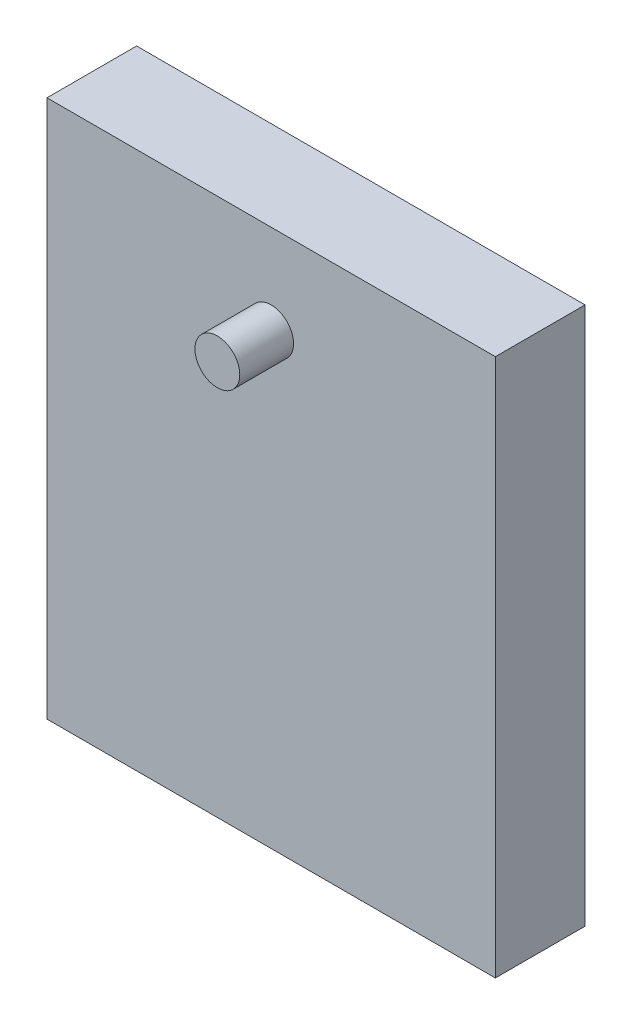
ISO-10303-21;
HEADER;
FILE_DESCRIPTION(('STEP AP214'),'2;1');
FILE_NAME('part.step','',(''),(''),'','','');
FILE_SCHEMA(('AUTOMOTIVE_DESIGN { 1 0 10303 214 1 1 1 1 }'));
ENDSEC;
DATA;
#1=APPLICATION_CONTEXT('core data for automotive mechanical design processes');
#2=APPLICATION_PROTOCOL_DEFINITION('international standard','automotive_design',2000,#1);
#3=PRODUCT_CONTEXT('',#1,'mechanical');
#4=PRODUCT('Part','Part','',(#3));
#5=PRODUCT_RELATED_PRODUCT_CATEGORY('part','',(#4));
#6=PRODUCT_DEFINITION_FORMATION('','',#4);
#7=PRODUCT_DEFINITION_CONTEXT('part definition',#1,'design');
#8=PRODUCT_DEFINITION('design','',#6,#7);
#9=PRODUCT_DEFINITION_SHAPE('','',#8);
#10=(LENGTH_UNIT() NAMED_UNIT(*) SI_UNIT(.MILLI.,.METRE.));
#11=(NAMED_UNIT(*) PLANE_ANGLE_UNIT() SI_UNIT($,.RADIAN.));
#12=(NAMED_UNIT(*) SI_UNIT($,.STERADIAN.) SOLID_ANGLE_UNIT());
#13=UNCERTAINTY_MEASURE_WITH_UNIT(LENGTH_MEASURE(1.E-05),#10,'distance_accuracy_value','');
#14=(GEOMETRIC_REPRESENTATION_CONTEXT(3) GLOBAL_UNCERTAINTY_ASSIGNED_CONTEXT((#13)) GLOBAL_UNIT_ASSIGNED_CONTEXT((#10,
#11,#12)) REPRESENTATION_CONTEXT('',''));
#15=CARTESIAN_POINT('',(0.,0.,0.));
#16=DIRECTION('',(0.,0.,1.));
#17=DIRECTION('',(1.,0.,0.));
#18=AXIS2_PLACEMENT_3D('',#15,#16,#17);
#19=CARTESIAN_POINT('',(0.,0.,10.));
#20=DIRECTION('',(0.,0.,1.));
#21=DIRECTION('',(1.,0.,0.));
#22=AXIS2_PLACEMENT_3D('',#19,#20,#21);
#23=PLANE('',#22);
#24=DIRECTION('',(0.,-1.,0.));
#25=VECTOR('',#24,1.);
#26=CARTESIAN_POINT('',(-30.644407926112,41.5015258215962,10.));
#27=LINE('',#26,#25);
#28=CARTESIAN_POINT('',(-30.644407926112,41.5015258215962,10.));
#29=VERTEX_POINT('',#28);
#30=CARTESIAN_POINT('',(-30.644407926112,-18.4984741784038,10.));
#31=VERTEX_POINT('',#30);
#32=EDGE_CURVE('E85',#29,#31,#27,.T.);
#33=ORIENTED_EDGE('',*,*,#32,.T.);
#34=DIRECTION('',(1.,0.,0.));
#35=VECTOR('',#34,1.);
#36=CARTESIAN_POINT('',(-30.644407926112,-18.4984741784038,10.));
#37=LINE('',#36,#35);
#38=CARTESIAN_POINT('',(19.355592073888,-18.4984741784038,10.));
#39=VERTEX_POINT('',#38);
#40=EDGE_CURVE('E80',#31,#39,#37,.T.);
#41=ORIENTED_EDGE('',*,*,#40,.T.);
#42=DIRECTION('',(0.,1.,0.));
#43=VECTOR('',#42,1.);
#44=CARTESIAN_POINT('',(19.355592073888,41.5015258215962,10.));
#45=LINE('',#44,#43);
#46=CARTESIAN_POINT('',(19.355592073888,41.5015258215962,10.));
#47=VERTEX_POINT('',#46);
#48=EDGE_CURVE('E83',#39,#47,#45,.T.);
#49=ORIENTED_EDGE('',*,*,#48,.T.);
#50=DIRECTION('',(-1.,0.,0.));
#51=VECTOR('',#50,1.);
#52=CARTESIAN_POINT('',(-30.644407926112,41.5015258215962,10.));
#53=LINE('',#52,#51);
#54=EDGE_CURVE('E50',#47,#29,#53,.T.);
#55=ORIENTED_EDGE('',*,*,#54,.T.);
#56=EDGE_LOOP('',(#33,#41,#49,#55));
#57=FACE_BOUND('',#56,.T.);
#58=CARTESIAN_POINT('',(-5.64440792611198,31.5015258215962,10.));
#59=DIRECTION('',(0.,0.,1.));
#60=DIRECTION('',(1.,0.,0.));
#61=AXIS2_PLACEMENT_3D('',#58,#59,#60);
#62=CIRCLE('',#61,2.5);
#63=CARTESIAN_POINT('',(-3.14440792611197,31.5015258215962,10.));
#64=VERTEX_POINT('',#63);
#65=EDGE_CURVE('E111',#64,#64,#62,.T.);
#66=ORIENTED_EDGE('',*,*,#65,.F.);
#67=EDGE_LOOP('',(#66));
#68=FACE_BOUND('',#67,.T.);
#69=ADVANCED_FACE('F33',(#57,#68),#23,.T.);
#70=CARTESIAN_POINT('',(-30.644407926112,41.5015258215962,10.));
#71=DIRECTION('',(1.,0.,0.));
#72=DIRECTION('',(0.,1.,0.));
#73=AXIS2_PLACEMENT_3D('',#70,#71,#72);
#74=PLANE('',#73);
#75=DIRECTION('',(0.,-1.,0.));
#76=VECTOR('',#75,1.);
#77=CARTESIAN_POINT('',(-30.644407926112,41.5015258215962,0.));
#78=LINE('',#77,#76);
#79=CARTESIAN_POINT('',(-30.644407926112,41.5015258215962,0.));
#80=VERTEX_POINT('',#79);
#81=CARTESIAN_POINT('',(-30.644407926112,-18.4984741784038,0.));
#82=VERTEX_POINT('',#81);
#83=EDGE_CURVE('E97',#80,#82,#78,.T.);
#84=ORIENTED_EDGE('',*,*,#83,.T.);
#85=DIRECTION('',(0.,0.,-1.));
#86=VECTOR('',#85,1.);
#87=CARTESIAN_POINT('',(-30.644407926112,-18.4984741784038,10.));
#88=LINE('',#87,#86);
#89=EDGE_CURVE('E11',#31,#82,#88,.T.);
#90=ORIENTED_EDGE('',*,*,#89,.F.);
#91=ORIENTED_EDGE('',*,*,#32,.F.);
#92=DIRECTION('',(0.,0.,-1.));
#93=VECTOR('',#92,1.);
#94=CARTESIAN_POINT('',(-30.644407926112,41.5015258215962,10.));
#95=LINE('',#94,#93);
#96=EDGE_CURVE('E93',#29,#80,#95,.T.);
#97=ORIENTED_EDGE('',*,*,#96,.T.);
#98=EDGE_LOOP('',(#84,#90,#91,#97));
#99=FACE_BOUND('',#98,.T.);
#100=ADVANCED_FACE('F35',(#99),#74,.F.);
#101=CARTESIAN_POINT('',(-30.644407926112,-18.4984741784038,10.));
#102=DIRECTION('',(0.,1.,0.));
#103=DIRECTION('',(0.,0.,1.));
#104=AXIS2_PLACEMENT_3D('',#101,#102,#103);
#105=PLANE('',#104);
#106=DIRECTION('',(1.,0.,0.));
#107=VECTOR('',#106,1.);
#108=CARTESIAN_POINT('',(-30.644407926112,-18.4984741784038,0.));
#109=LINE('',#108,#107);
#110=CARTESIAN_POINT('',(19.355592073888,-18.4984741784038,0.));
#111=VERTEX_POINT('',#110);
#112=EDGE_CURVE('E89',#82,#111,#109,.T.);
#113=ORIENTED_EDGE('',*,*,#112,.T.);
#114=DIRECTION('',(0.,0.,-1.));
#115=VECTOR('',#114,1.);
#116=CARTESIAN_POINT('',(19.355592073888,-18.4984741784038,10.));
#117=LINE('',#116,#115);
#118=EDGE_CURVE('E42',#39,#111,#117,.T.);
#119=ORIENTED_EDGE('',*,*,#118,.F.);
#120=ORIENTED_EDGE('',*,*,#40,.F.);
#121=ORIENTED_EDGE('',*,*,#89,.T.);
#122=EDGE_LOOP('',(#113,#119,#120,#121));
#123=FACE_BOUND('',#122,.T.);
#124=ADVANCED_FACE('F88',(#123),#105,.F.);
#125=CARTESIAN_POINT('',(19.355592073888,41.5015258215962,10.));
#126=DIRECTION('',(-1.,0.,0.));
#127=DIRECTION('',(0.,-1.,0.));
#128=AXIS2_PLACEMENT_3D('',#125,#126,#127);
#129=PLANE('',#128);
#130=DIRECTION('',(0.,1.,0.));
#131=VECTOR('',#130,1.);
#132=CARTESIAN_POINT('',(19.355592073888,41.5015258215962,0.));
#133=LINE('',#132,#131);
#134=CARTESIAN_POINT('',(19.355592073888,41.5015258215962,0.));
#135=VERTEX_POINT('',#134);
#136=EDGE_CURVE('E67',#111,#135,#133,.T.);
#137=ORIENTED_EDGE('',*,*,#136,.T.);
#138=DIRECTION('',(0.,0.,-1.));
#139=VECTOR('',#138,1.);
#140=CARTESIAN_POINT('',(19.355592073888,41.5015258215962,10.));
#141=LINE('',#140,#139);
#142=EDGE_CURVE('E90',#47,#135,#141,.T.);
#143=ORIENTED_EDGE('',*,*,#142,.F.);
#144=ORIENTED_EDGE('',*,*,#48,.F.);
#145=ORIENTED_EDGE('',*,*,#118,.T.);
#146=EDGE_LOOP('',(#137,#143,#144,#145));
#147=FACE_BOUND('',#146,.T.);
#148=ADVANCED_FACE('F91',(#147),#129,.F.);
#149=CARTESIAN_POINT('',(-30.644407926112,41.5015258215962,10.));
#150=DIRECTION('',(0.,-1.,0.));
#151=DIRECTION('',(0.,0.,-1.));
#152=AXIS2_PLACEMENT_3D('',#149,#150,#151);
#153=PLANE('',#152);
#154=DIRECTION('',(-1.,0.,0.));
#155=VECTOR('',#154,1.);
#156=CARTESIAN_POINT('',(-30.644407926112,41.5015258215962,0.));
#157=LINE('',#156,#155);
#158=EDGE_CURVE('E73',#135,#80,#157,.T.);
#159=ORIENTED_EDGE('',*,*,#158,.T.);
#160=ORIENTED_EDGE('',*,*,#96,.F.);
#161=ORIENTED_EDGE('',*,*,#54,.F.);
#162=ORIENTED_EDGE('',*,*,#142,.T.);
#163=EDGE_LOOP('',(#159,#160,#161,#162));
#164=FACE_BOUND('',#163,.T.);
#165=ADVANCED_FACE('F105',(#164),#153,.F.);
#166=CARTESIAN_POINT('',(0.,0.,0.));
#167=DIRECTION('',(0.,0.,1.));
#168=DIRECTION('',(1.,0.,0.));
#169=AXIS2_PLACEMENT_3D('',#166,#167,#168);
#170=PLANE('',#169);
#171=ORIENTED_EDGE('',*,*,#83,.F.);
#172=ORIENTED_EDGE('',*,*,#158,.F.);
#173=ORIENTED_EDGE('',*,*,#136,.F.);
#174=ORIENTED_EDGE('',*,*,#112,.F.);
#175=EDGE_LOOP('',(#171,#172,#173,#174));
#176=FACE_BOUND('',#175,.T.);
#177=ADVANCED_FACE('F108',(#176),#170,.F.);
#178=CARTESIAN_POINT('',(-5.64440792611198,31.5015258215962,16.));
#179=DIRECTION('',(0.,0.,-1.));
#180=DIRECTION('',(-1.,0.,0.));
#181=AXIS2_PLACEMENT_3D('',#178,#179,#180);
#182=CYLINDRICAL_SURFACE('',#181,2.5);
#183=CARTESIAN_POINT('',(-5.64440792611198,31.5015258215962,16.));
#184=DIRECTION('',(0.,0.,1.));
#185=DIRECTION('',(1.,0.,0.));
#186=AXIS2_PLACEMENT_3D('',#183,#184,#185);
#187=CIRCLE('',#186,2.5);
#188=CARTESIAN_POINT('',(-3.14440792611197,31.5015258215962,16.));
#189=VERTEX_POINT('',#188);
#190=EDGE_CURVE('E100',#189,#189,#187,.T.);
#191=ORIENTED_EDGE('',*,*,#190,.F.);
#192=EDGE_LOOP('',(#191));
#193=FACE_BOUND('',#192,.T.);
#194=ORIENTED_EDGE('',*,*,#65,.T.);
#195=EDGE_LOOP('',(#194));
#196=FACE_BOUND('',#195,.T.);
#197=ADVANCED_FACE('F119',(#193,#196),#182,.T.);
#198=CARTESIAN_POINT('',(-5.64440792611198,31.5015258215962,16.));
#199=DIRECTION('',(0.,0.,1.));
#200=DIRECTION('',(1.,0.,0.));
#201=AXIS2_PLACEMENT_3D('',#198,#199,#200);
#202=PLANE('',#201);
#203=ORIENTED_EDGE('',*,*,#190,.T.);
#204=EDGE_LOOP('',(#203));
#205=FACE_BOUND('',#204,.T.);
#206=ADVANCED_FACE('F117',(#205),#202,.T.);
#207=CLOSED_SHELL('',(#69,#100,#124,#148,#165,#177,#197,#206));
#208=MANIFOLD_SOLID_BREP('B2',#207);
#209=ADVANCED_BREP_SHAPE_REPRESENTATION('',(#18,#208),#14);
#210=SHAPE_DEFINITION_REPRESENTATION(#9,#209);
ENDSEC;
END-ISO-10303-21;
